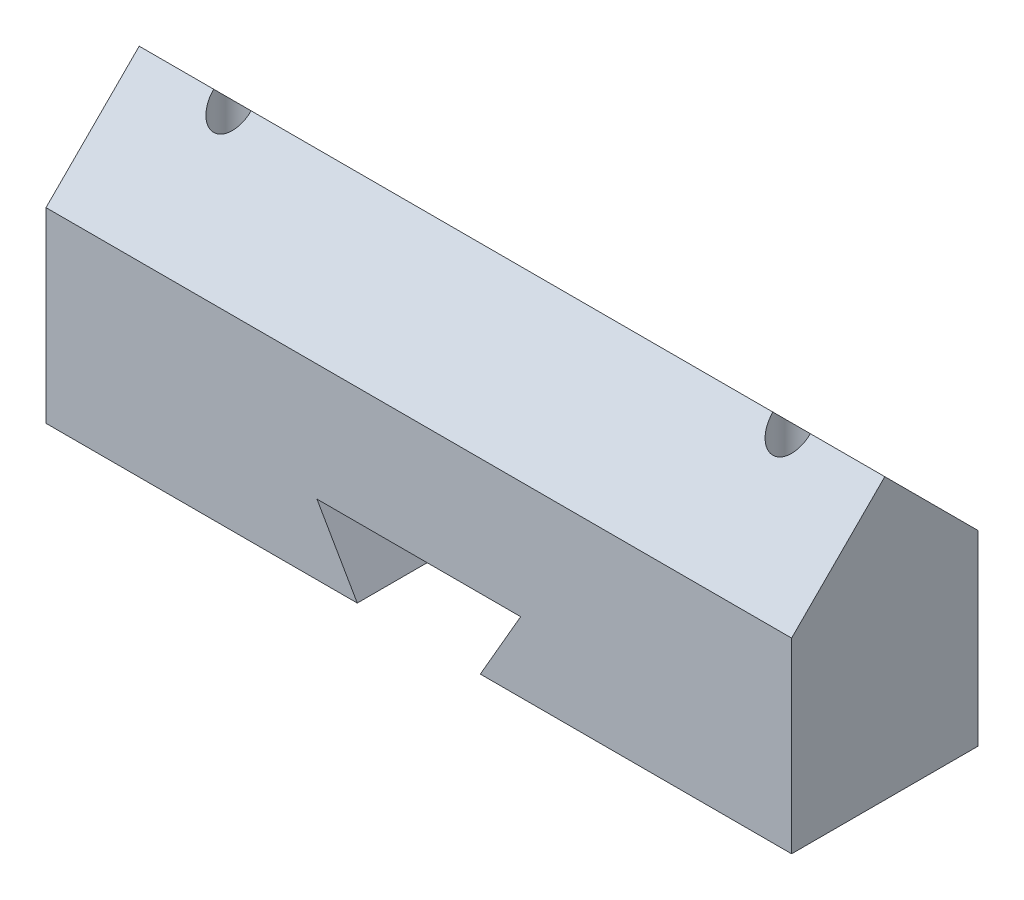
ISO-10303-21;
HEADER;
FILE_DESCRIPTION(('STEP AP214'),'2;1');
FILE_NAME('part.step','',(''),(''),'','','');
FILE_SCHEMA(('AUTOMOTIVE_DESIGN { 1 0 10303 214 1 1 1 1 }'));
ENDSEC;
DATA;
#1=APPLICATION_CONTEXT('core data for automotive mechanical design processes');
#2=APPLICATION_PROTOCOL_DEFINITION('international standard','automotive_design',2000,#1);
#3=PRODUCT_CONTEXT('',#1,'mechanical');
#4=PRODUCT('Part','Part','',(#3));
#5=PRODUCT_RELATED_PRODUCT_CATEGORY('part','',(#4));
#6=PRODUCT_DEFINITION_FORMATION('','',#4);
#7=PRODUCT_DEFINITION_CONTEXT('part definition',#1,'design');
#8=PRODUCT_DEFINITION('design','',#6,#7);
#9=PRODUCT_DEFINITION_SHAPE('','',#8);
#10=(LENGTH_UNIT() NAMED_UNIT(*) SI_UNIT(.MILLI.,.METRE.));
#11=(NAMED_UNIT(*) PLANE_ANGLE_UNIT() SI_UNIT($,.RADIAN.));
#12=(NAMED_UNIT(*) SI_UNIT($,.STERADIAN.) SOLID_ANGLE_UNIT());
#13=UNCERTAINTY_MEASURE_WITH_UNIT(LENGTH_MEASURE(1.E-05),#10,'distance_accuracy_value','');
#14=(GEOMETRIC_REPRESENTATION_CONTEXT(3) GLOBAL_UNCERTAINTY_ASSIGNED_CONTEXT((#13)) GLOBAL_UNIT_ASSIGNED_CONTEXT((#10,
#11,#12)) REPRESENTATION_CONTEXT('',''));
#15=CARTESIAN_POINT('',(0.,0.,0.));
#16=DIRECTION('',(0.,0.,1.));
#17=DIRECTION('',(1.,0.,0.));
#18=AXIS2_PLACEMENT_3D('',#15,#16,#17);
#19=CARTESIAN_POINT('',(-42.418,0.,25.4));
#20=DIRECTION('',(0.,1.,0.));
#21=DIRECTION('',(0.,0.,1.));
#22=AXIS2_PLACEMENT_3D('',#19,#20,#21);
#23=PLANE('',#22);
#24=DIRECTION('',(1.,0.,0.));
#25=VECTOR('',#24,1.);
#26=CARTESIAN_POINT('',(-42.418,0.,0.));
#27=LINE('',#26,#25);
#28=CARTESIAN_POINT('',(-42.418,0.,0.));
#29=VERTEX_POINT('',#28);
#30=CARTESIAN_POINT('',(0.,0.,0.));
#31=VERTEX_POINT('',#30);
#32=EDGE_CURVE('E170',#29,#31,#27,.T.);
#33=ORIENTED_EDGE('',*,*,#32,.T.);
#34=DIRECTION('',(0.,0.,-1.));
#35=VECTOR('',#34,1.);
#36=CARTESIAN_POINT('',(0.,0.,25.4));
#37=LINE('',#36,#35);
#38=CARTESIAN_POINT('',(0.,0.,25.4));
#39=VERTEX_POINT('',#38);
#40=EDGE_CURVE('E240',#39,#31,#37,.T.);
#41=ORIENTED_EDGE('',*,*,#40,.F.);
#42=DIRECTION('',(1.,0.,0.));
#43=VECTOR('',#42,1.);
#44=CARTESIAN_POINT('',(-42.418,0.,25.4));
#45=LINE('',#44,#43);
#46=CARTESIAN_POINT('',(-42.418,0.,25.4));
#47=VERTEX_POINT('',#46);
#48=EDGE_CURVE('E175',#47,#39,#45,.T.);
#49=ORIENTED_EDGE('',*,*,#48,.F.);
#50=DIRECTION('',(0.,0.,-1.));
#51=VECTOR('',#50,1.);
#52=CARTESIAN_POINT('',(-42.418,0.,25.4));
#53=LINE('',#52,#51);
#54=EDGE_CURVE('E199',#47,#29,#53,.T.);
#55=ORIENTED_EDGE('',*,*,#54,.T.);
#56=EDGE_LOOP('',(#33,#41,#49,#55));
#57=FACE_BOUND('',#56,.T.);
#58=ADVANCED_FACE('F40',(#57),#23,.F.);
#59=CARTESIAN_POINT('',(0.,0.,25.4));
#60=DIRECTION('',(-0.866025403784436,-0.500000000000004,0.));
#61=DIRECTION('',(0.500000000000004,-0.866025403784436,0.));
#62=AXIS2_PLACEMENT_3D('',#59,#60,#61);
#63=PLANE('',#62);
#64=DIRECTION('',(-0.500000000000004,0.866025403784436,0.));
#65=VECTOR('',#64,1.);
#66=CARTESIAN_POINT('',(0.,0.,0.));
#67=LINE('',#66,#65);
#68=CARTESIAN_POINT('',(-5.49926131403125,9.525,0.));
#69=VERTEX_POINT('',#68);
#70=EDGE_CURVE('E203',#31,#69,#67,.T.);
#71=ORIENTED_EDGE('',*,*,#70,.T.);
#72=DIRECTION('',(0.,0.,-1.));
#73=VECTOR('',#72,1.);
#74=CARTESIAN_POINT('',(-5.49926131403125,9.525,25.4));
#75=LINE('',#74,#73);
#76=CARTESIAN_POINT('',(-5.49926131403125,9.525,25.4));
#77=VERTEX_POINT('',#76);
#78=EDGE_CURVE('E236',#77,#69,#75,.T.);
#79=ORIENTED_EDGE('',*,*,#78,.F.);
#80=DIRECTION('',(-0.500000000000004,0.866025403784436,0.));
#81=VECTOR('',#80,1.);
#82=CARTESIAN_POINT('',(0.,0.,25.4));
#83=LINE('',#82,#81);
#84=EDGE_CURVE('E179',#39,#77,#83,.T.);
#85=ORIENTED_EDGE('',*,*,#84,.F.);
#86=ORIENTED_EDGE('',*,*,#40,.T.);
#87=EDGE_LOOP('',(#71,#79,#85,#86));
#88=FACE_BOUND('',#87,.T.);
#89=ADVANCED_FACE('F286',(#88),#63,.F.);
#90=CARTESIAN_POINT('',(-5.49926131403125,9.525,25.4));
#91=DIRECTION('',(0.,1.,0.));
#92=DIRECTION('',(0.,0.,1.));
#93=AXIS2_PLACEMENT_3D('',#90,#91,#92);
#94=PLANE('',#93);
#95=DIRECTION('',(1.,0.,0.));
#96=VECTOR('',#95,1.);
#97=CARTESIAN_POINT('',(-5.49926131403125,9.525,0.));
#98=LINE('',#97,#96);
#99=CARTESIAN_POINT('',(22.2632613140312,9.525,0.));
#100=VERTEX_POINT('',#99);
#101=EDGE_CURVE('E206',#69,#100,#98,.T.);
#102=ORIENTED_EDGE('',*,*,#101,.T.);
#103=DIRECTION('',(0.,0.,-1.));
#104=VECTOR('',#103,1.);
#105=CARTESIAN_POINT('',(22.2632613140312,9.525,25.4));
#106=LINE('',#105,#104);
#107=CARTESIAN_POINT('',(22.2632613140312,9.525,25.4));
#108=VERTEX_POINT('',#107);
#109=EDGE_CURVE('E232',#108,#100,#106,.T.);
#110=ORIENTED_EDGE('',*,*,#109,.F.);
#111=DIRECTION('',(1.,0.,0.));
#112=VECTOR('',#111,1.);
#113=CARTESIAN_POINT('',(-5.49926131403125,9.525,25.4));
#114=LINE('',#113,#112);
#115=EDGE_CURVE('E183',#77,#108,#114,.T.);
#116=ORIENTED_EDGE('',*,*,#115,.F.);
#117=ORIENTED_EDGE('',*,*,#78,.T.);
#118=EDGE_LOOP('',(#102,#110,#116,#117));
#119=FACE_BOUND('',#118,.T.);
#120=ADVANCED_FACE('F283',(#119),#94,.F.);
#121=CARTESIAN_POINT('',(22.2632613140312,9.525,25.4));
#122=DIRECTION('',(0.866025403784436,-0.500000000000004,0.));
#123=DIRECTION('',(0.500000000000004,0.866025403784436,0.));
#124=AXIS2_PLACEMENT_3D('',#121,#122,#123);
#125=PLANE('',#124);
#126=DIRECTION('',(-0.500000000000004,-0.866025403784436,0.));
#127=VECTOR('',#126,1.);
#128=CARTESIAN_POINT('',(22.2632613140312,9.525,0.));
#129=LINE('',#128,#127);
#130=CARTESIAN_POINT('',(16.764,0.,0.));
#131=VERTEX_POINT('',#130);
#132=EDGE_CURVE('E209',#100,#131,#129,.T.);
#133=ORIENTED_EDGE('',*,*,#132,.T.);
#134=DIRECTION('',(0.,0.,-1.));
#135=VECTOR('',#134,1.);
#136=CARTESIAN_POINT('',(16.764,0.,25.4));
#137=LINE('',#136,#135);
#138=CARTESIAN_POINT('',(16.764,0.,25.4));
#139=VERTEX_POINT('',#138);
#140=EDGE_CURVE('E228',#139,#131,#137,.T.);
#141=ORIENTED_EDGE('',*,*,#140,.F.);
#142=DIRECTION('',(-0.500000000000004,-0.866025403784436,0.));
#143=VECTOR('',#142,1.);
#144=CARTESIAN_POINT('',(22.2632613140312,9.525,25.4));
#145=LINE('',#144,#143);
#146=EDGE_CURVE('E186',#108,#139,#145,.T.);
#147=ORIENTED_EDGE('',*,*,#146,.F.);
#148=ORIENTED_EDGE('',*,*,#109,.T.);
#149=EDGE_LOOP('',(#133,#141,#147,#148));
#150=FACE_BOUND('',#149,.T.);
#151=ADVANCED_FACE('F278',(#150),#125,.F.);
#152=CARTESIAN_POINT('',(16.764,0.,25.4));
#153=DIRECTION('',(0.,1.,0.));
#154=DIRECTION('',(0.,0.,1.));
#155=AXIS2_PLACEMENT_3D('',#152,#153,#154);
#156=PLANE('',#155);
#157=DIRECTION('',(1.,0.,0.));
#158=VECTOR('',#157,1.);
#159=CARTESIAN_POINT('',(16.764,0.,0.));
#160=LINE('',#159,#158);
#161=CARTESIAN_POINT('',(59.182,0.,0.));
#162=VERTEX_POINT('',#161);
#163=EDGE_CURVE('E212',#131,#162,#160,.T.);
#164=ORIENTED_EDGE('',*,*,#163,.T.);
#165=DIRECTION('',(0.,0.,-1.));
#166=VECTOR('',#165,1.);
#167=CARTESIAN_POINT('',(59.182,0.,25.4));
#168=LINE('',#167,#166);
#169=CARTESIAN_POINT('',(59.182,0.,25.4));
#170=VERTEX_POINT('',#169);
#171=EDGE_CURVE('E224',#170,#162,#168,.T.);
#172=ORIENTED_EDGE('',*,*,#171,.F.);
#173=DIRECTION('',(1.,0.,0.));
#174=VECTOR('',#173,1.);
#175=CARTESIAN_POINT('',(16.764,0.,25.4));
#176=LINE('',#175,#174);
#177=EDGE_CURVE('E189',#139,#170,#176,.T.);
#178=ORIENTED_EDGE('',*,*,#177,.F.);
#179=ORIENTED_EDGE('',*,*,#140,.T.);
#180=EDGE_LOOP('',(#164,#172,#178,#179));
#181=FACE_BOUND('',#180,.T.);
#182=ADVANCED_FACE('F273',(#181),#156,.F.);
#183=CARTESIAN_POINT('',(59.182,0.,25.4));
#184=DIRECTION('',(-1.,0.,0.));
#185=DIRECTION('',(0.,0.,1.));
#186=AXIS2_PLACEMENT_3D('',#183,#184,#185);
#187=PLANE('',#186);
#188=DIRECTION('',(0.,0.707106781186549,0.707106781186546));
#189=VECTOR('',#188,1.);
#190=CARTESIAN_POINT('',(59.182,12.7302380952381,-12.7302380952382));
#191=LINE('',#190,#189);
#192=CARTESIAN_POINT('',(59.182,25.4604761904764,0.));
#193=VERTEX_POINT('',#192);
#194=CARTESIAN_POINT('',(59.182,38.1604761904764,12.7));
#195=VERTEX_POINT('',#194);
#196=EDGE_CURVE('E158',#193,#195,#191,.T.);
#197=ORIENTED_EDGE('',*,*,#196,.T.);
#198=DIRECTION('',(0.,-0.707106781186552,0.707106781186543));
#199=VECTOR('',#198,1.);
#200=CARTESIAN_POINT('',(59.182,25.430238095238,25.4302380952383));
#201=LINE('',#200,#199);
#202=CARTESIAN_POINT('',(59.182,25.4604761904763,25.4));
#203=VERTEX_POINT('',#202);
#204=EDGE_CURVE('E147',#195,#203,#201,.T.);
#205=ORIENTED_EDGE('',*,*,#204,.T.);
#206=DIRECTION('',(0.,1.,0.));
#207=VECTOR('',#206,1.);
#208=CARTESIAN_POINT('',(59.182,0.,25.4));
#209=LINE('',#208,#207);
#210=EDGE_CURVE('E192',#170,#203,#209,.T.);
#211=ORIENTED_EDGE('',*,*,#210,.F.);
#212=ORIENTED_EDGE('',*,*,#171,.T.);
#213=DIRECTION('',(0.,1.,0.));
#214=VECTOR('',#213,1.);
#215=CARTESIAN_POINT('',(59.182,0.,0.));
#216=LINE('',#215,#214);
#217=EDGE_CURVE('E215',#162,#193,#216,.T.);
#218=ORIENTED_EDGE('',*,*,#217,.T.);
#219=EDGE_LOOP('',(#197,#205,#211,#212,#218));
#220=FACE_BOUND('',#219,.T.);
#221=ADVANCED_FACE('F268',(#220),#187,.F.);
#222=CARTESIAN_POINT('',(-42.418,38.1604761904764,25.4));
#223=DIRECTION('',(1.,0.,0.));
#224=DIRECTION('',(0.,1.,0.));
#225=AXIS2_PLACEMENT_3D('',#222,#223,#224);
#226=PLANE('',#225);
#227=DIRECTION('',(0.,-1.,0.));
#228=VECTOR('',#227,1.);
#229=CARTESIAN_POINT('',(-42.418,38.1604761904764,25.4));
#230=LINE('',#229,#228);
#231=CARTESIAN_POINT('',(-42.418,25.4604761904763,25.4));
#232=VERTEX_POINT('',#231);
#233=EDGE_CURVE('E196',#232,#47,#230,.T.);
#234=ORIENTED_EDGE('',*,*,#233,.F.);
#235=DIRECTION('',(0.,-0.707106781186552,0.707106781186543));
#236=VECTOR('',#235,1.);
#237=CARTESIAN_POINT('',(-42.418,25.430238095238,25.4302380952383));
#238=LINE('',#237,#236);
#239=CARTESIAN_POINT('',(-42.418,38.1604761904764,12.7));
#240=VERTEX_POINT('',#239);
#241=EDGE_CURVE('E146',#240,#232,#238,.T.);
#242=ORIENTED_EDGE('',*,*,#241,.F.);
#243=DIRECTION('',(0.,0.707106781186549,0.707106781186546));
#244=VECTOR('',#243,1.);
#245=CARTESIAN_POINT('',(-42.418,12.7302380952381,-12.7302380952382));
#246=LINE('',#245,#244);
#247=CARTESIAN_POINT('',(-42.418,25.4604761904763,0.));
#248=VERTEX_POINT('',#247);
#249=EDGE_CURVE('E157',#248,#240,#246,.T.);
#250=ORIENTED_EDGE('',*,*,#249,.F.);
#251=DIRECTION('',(0.,-1.,0.));
#252=VECTOR('',#251,1.);
#253=CARTESIAN_POINT('',(-42.418,38.1604761904764,0.));
#254=LINE('',#253,#252);
#255=EDGE_CURVE('E180',#248,#29,#254,.T.);
#256=ORIENTED_EDGE('',*,*,#255,.T.);
#257=ORIENTED_EDGE('',*,*,#54,.F.);
#258=EDGE_LOOP('',(#234,#242,#250,#256,#257));
#259=FACE_BOUND('',#258,.T.);
#260=ADVANCED_FACE('F258',(#259),#226,.F.);
#261=CARTESIAN_POINT('',(0.,0.,25.4));
#262=DIRECTION('',(0.,0.,1.));
#263=DIRECTION('',(1.,0.,0.));
#264=AXIS2_PLACEMENT_3D('',#261,#262,#263);
#265=PLANE('',#264);
#266=DIRECTION('',(-1.,0.,0.));
#267=VECTOR('',#266,1.);
#268=CARTESIAN_POINT('',(59.182,25.4604761904763,25.4));
#269=LINE('',#268,#267);
#270=EDGE_CURVE('E151',#203,#232,#269,.T.);
#271=ORIENTED_EDGE('',*,*,#270,.T.);
#272=ORIENTED_EDGE('',*,*,#233,.T.);
#273=ORIENTED_EDGE('',*,*,#48,.T.);
#274=ORIENTED_EDGE('',*,*,#84,.T.);
#275=ORIENTED_EDGE('',*,*,#115,.T.);
#276=ORIENTED_EDGE('',*,*,#146,.T.);
#277=ORIENTED_EDGE('',*,*,#177,.T.);
#278=ORIENTED_EDGE('',*,*,#210,.T.);
#279=EDGE_LOOP('',(#271,#272,#273,#274,#275,#276,#277,#278));
#280=FACE_BOUND('',#279,.T.);
#281=ADVANCED_FACE('F291',(#280),#265,.T.);
#282=CARTESIAN_POINT('',(0.,0.,0.));
#283=DIRECTION('',(0.,0.,1.));
#284=DIRECTION('',(1.,0.,0.));
#285=AXIS2_PLACEMENT_3D('',#282,#283,#284);
#286=PLANE('',#285);
#287=ORIENTED_EDGE('',*,*,#255,.F.);
#288=DIRECTION('',(-1.,0.,0.));
#289=VECTOR('',#288,1.);
#290=CARTESIAN_POINT('',(59.182,25.4604761904764,0.));
#291=LINE('',#290,#289);
#292=EDGE_CURVE('E162',#193,#248,#291,.T.);
#293=ORIENTED_EDGE('',*,*,#292,.F.);
#294=ORIENTED_EDGE('',*,*,#217,.F.);
#295=ORIENTED_EDGE('',*,*,#163,.F.);
#296=ORIENTED_EDGE('',*,*,#132,.F.);
#297=ORIENTED_EDGE('',*,*,#101,.F.);
#298=ORIENTED_EDGE('',*,*,#70,.F.);
#299=ORIENTED_EDGE('',*,*,#32,.F.);
#300=EDGE_LOOP('',(#287,#293,#294,#295,#296,#297,#298,#299));
#301=FACE_BOUND('',#300,.T.);
#302=ADVANCED_FACE('F264',(#301),#286,.F.);
#303=CARTESIAN_POINT('',(59.182,12.7302380952381,-12.7302380952382));
#304=DIRECTION('',(0.,-0.707106781186546,0.707106781186549));
#305=DIRECTION('',(0.,-0.707106781186549,-0.707106781186546));
#306=AXIS2_PLACEMENT_3D('',#303,#304,#305);
#307=PLANE('',#306);
#308=DIRECTION('',(-1.,0.,0.));
#309=VECTOR('',#308,1.);
#310=CARTESIAN_POINT('',(59.182,38.1604761904764,12.7));
#311=LINE('',#310,#309);
#312=CARTESIAN_POINT('',(-32.2707,38.1604761904764,12.7));
#313=VERTEX_POINT('',#312);
#314=EDGE_CURVE('E172',#313,#240,#311,.T.);
#315=ORIENTED_EDGE('',*,*,#314,.F.);
#316=CARTESIAN_POINT('',(-29.718,38.1604761904764,12.7));
#317=DIRECTION('',(0.,-0.707106781186546,0.707106781186549));
#318=DIRECTION('',(0.,0.707106781186549,0.707106781186546));
#319=AXIS2_PLACEMENT_3D('',#316,#317,#318);
#320=ELLIPSE('',#319,3.61006296066979,2.55269999999999);
#321=CARTESIAN_POINT('',(-27.1653,38.1604761904764,12.7));
#322=VERTEX_POINT('',#321);
#323=EDGE_CURVE('E54',#313,#322,#320,.T.);
#324=ORIENTED_EDGE('',*,*,#323,.T.);
#325=CARTESIAN_POINT('',(43.9293,38.1604761904764,12.7));
#326=VERTEX_POINT('',#325);
#327=EDGE_CURVE('E171',#326,#322,#311,.T.);
#328=ORIENTED_EDGE('',*,*,#327,.F.);
#329=CARTESIAN_POINT('',(46.482,38.1604761904764,12.7));
#330=DIRECTION('',(0.,-0.707106781186546,0.707106781186549));
#331=DIRECTION('',(0.,0.707106781186549,0.707106781186546));
#332=AXIS2_PLACEMENT_3D('',#329,#330,#331);
#333=ELLIPSE('',#332,3.61006296066979,2.55269999999999);
#334=CARTESIAN_POINT('',(49.0347,38.1604761904764,12.7));
#335=VERTEX_POINT('',#334);
#336=EDGE_CURVE('E60',#326,#335,#333,.T.);
#337=ORIENTED_EDGE('',*,*,#336,.T.);
#338=EDGE_CURVE('E166',#195,#335,#311,.T.);
#339=ORIENTED_EDGE('',*,*,#338,.F.);
#340=ORIENTED_EDGE('',*,*,#196,.F.);
#341=ORIENTED_EDGE('',*,*,#292,.T.);
#342=ORIENTED_EDGE('',*,*,#249,.T.);
#343=EDGE_LOOP('',(#315,#324,#328,#337,#339,#340,#341,#342));
#344=FACE_BOUND('',#343,.T.);
#345=ADVANCED_FACE('F251',(#344),#307,.F.);
#346=CARTESIAN_POINT('',(59.182,25.430238095238,25.4302380952383));
#347=DIRECTION('',(0.,-0.707106781186543,-0.707106781186552));
#348=DIRECTION('',(0.,0.707106781186552,-0.707106781186543));
#349=AXIS2_PLACEMENT_3D('',#346,#347,#348);
#350=PLANE('',#349);
#351=ORIENTED_EDGE('',*,*,#327,.T.);
#352=CARTESIAN_POINT('',(-29.718,38.1604761904764,12.7));
#353=DIRECTION('',(0.,-0.707106781186543,-0.707106781186552));
#354=DIRECTION('',(0.,0.707106781186552,-0.707106781186543));
#355=AXIS2_PLACEMENT_3D('',#352,#353,#354);
#356=ELLIPSE('',#355,3.6100629606698,2.55269999999999);
#357=EDGE_CURVE('E12',#322,#313,#356,.T.);
#358=ORIENTED_EDGE('',*,*,#357,.T.);
#359=ORIENTED_EDGE('',*,*,#314,.T.);
#360=ORIENTED_EDGE('',*,*,#241,.T.);
#361=ORIENTED_EDGE('',*,*,#270,.F.);
#362=ORIENTED_EDGE('',*,*,#204,.F.);
#363=ORIENTED_EDGE('',*,*,#338,.T.);
#364=CARTESIAN_POINT('',(46.482,38.1604761904764,12.7));
#365=DIRECTION('',(0.,-0.707106781186543,-0.707106781186552));
#366=DIRECTION('',(0.,0.707106781186552,-0.707106781186543));
#367=AXIS2_PLACEMENT_3D('',#364,#365,#366);
#368=ELLIPSE('',#367,3.6100629606698,2.55269999999999);
#369=EDGE_CURVE('E48',#335,#326,#368,.T.);
#370=ORIENTED_EDGE('',*,*,#369,.T.);
#371=EDGE_LOOP('',(#351,#358,#359,#360,#361,#362,#363,#370));
#372=FACE_BOUND('',#371,.T.);
#373=ADVANCED_FACE('F247',(#372),#350,.F.);
#374=CARTESIAN_POINT('',(46.482,38.1604761904764,12.7));
#375=DIRECTION('',(0.,1.,0.));
#376=DIRECTION('',(0.,0.,1.));
#377=AXIS2_PLACEMENT_3D('',#374,#375,#376);
#378=CYLINDRICAL_SURFACE('',#377,2.55269999999999);
#379=CARTESIAN_POINT('',(46.482,21.6504761904764,12.7));
#380=DIRECTION('',(0.,1.,0.));
#381=DIRECTION('',(0.,0.,1.));
#382=AXIS2_PLACEMENT_3D('',#379,#380,#381);
#383=CIRCLE('',#382,2.55269999999998);
#384=CARTESIAN_POINT('',(46.482,21.6504761904764,15.2527));
#385=VERTEX_POINT('',#384);
#386=EDGE_CURVE('E138',#385,#385,#383,.T.);
#387=ORIENTED_EDGE('',*,*,#386,.F.);
#388=EDGE_LOOP('',(#387));
#389=FACE_BOUND('',#388,.T.);
#390=ORIENTED_EDGE('',*,*,#369,.F.);
#391=ORIENTED_EDGE('',*,*,#336,.F.);
#392=EDGE_LOOP('',(#390,#391));
#393=FACE_BOUND('',#392,.T.);
#394=ADVANCED_FACE('F349',(#389,#393),#378,.F.);
#395=CARTESIAN_POINT('',(46.482,21.6504761904764,12.7));
#396=DIRECTION('',(0.,1.,0.));
#397=DIRECTION('',(0.,0.,1.));
#398=AXIS2_PLACEMENT_3D('',#395,#396,#397);
#399=CONICAL_SURFACE('',#398,2.55269999999998,1.02974425867665);
#400=CARTESIAN_POINT('',(46.482,20.1166592882848,12.7));
#401=VERTEX_POINT('',#400);
#402=VERTEX_LOOP('',#401);
#403=FACE_BOUND('',#402,.T.);
#404=ORIENTED_EDGE('',*,*,#386,.T.);
#405=EDGE_LOOP('',(#404));
#406=FACE_BOUND('',#405,.T.);
#407=ADVANCED_FACE('F358',(#403,#406),#399,.F.);
#408=CARTESIAN_POINT('',(-29.718,38.1604761904764,12.7));
#409=DIRECTION('',(0.,1.,0.));
#410=DIRECTION('',(0.,0.,1.));
#411=AXIS2_PLACEMENT_3D('',#408,#409,#410);
#412=CYLINDRICAL_SURFACE('',#411,2.55269999999999);
#413=CARTESIAN_POINT('',(-29.718,21.6504761904764,12.7));
#414=DIRECTION('',(0.,1.,0.));
#415=DIRECTION('',(0.,0.,1.));
#416=AXIS2_PLACEMENT_3D('',#413,#414,#415);
#417=CIRCLE('',#416,2.55269999999999);
#418=CARTESIAN_POINT('',(-29.718,21.6504761904764,15.2527));
#419=VERTEX_POINT('',#418);
#420=EDGE_CURVE('E133',#419,#419,#417,.T.);
#421=ORIENTED_EDGE('',*,*,#420,.F.);
#422=EDGE_LOOP('',(#421));
#423=FACE_BOUND('',#422,.T.);
#424=ORIENTED_EDGE('',*,*,#357,.F.);
#425=ORIENTED_EDGE('',*,*,#323,.F.);
#426=EDGE_LOOP('',(#424,#425));
#427=FACE_BOUND('',#426,.T.);
#428=ADVANCED_FACE('F129',(#423,#427),#412,.F.);
#429=CARTESIAN_POINT('',(-29.718,21.6504761904764,12.7));
#430=DIRECTION('',(0.,1.,0.));
#431=DIRECTION('',(0.,0.,1.));
#432=AXIS2_PLACEMENT_3D('',#429,#430,#431);
#433=CONICAL_SURFACE('',#432,2.55269999999999,1.02974425867665);
#434=CARTESIAN_POINT('',(-29.718,20.1166592882848,12.7));
#435=VERTEX_POINT('',#434);
#436=VERTEX_LOOP('',#435);
#437=FACE_BOUND('',#436,.T.);
#438=ORIENTED_EDGE('',*,*,#420,.T.);
#439=EDGE_LOOP('',(#438));
#440=FACE_BOUND('',#439,.T.);
#441=ADVANCED_FACE('F126',(#437,#440),#433,.F.);
#442=CLOSED_SHELL('',(#58,#89,#120,#151,#182,#221,#260,#281,#302,#345,#373,#394,#407,#428,#441));
#443=MANIFOLD_SOLID_BREP('B2',#442);
#444=ADVANCED_BREP_SHAPE_REPRESENTATION('',(#18,#443),#14);
#445=SHAPE_DEFINITION_REPRESENTATION(#9,#444);
ENDSEC;
END-ISO-10303-21;
